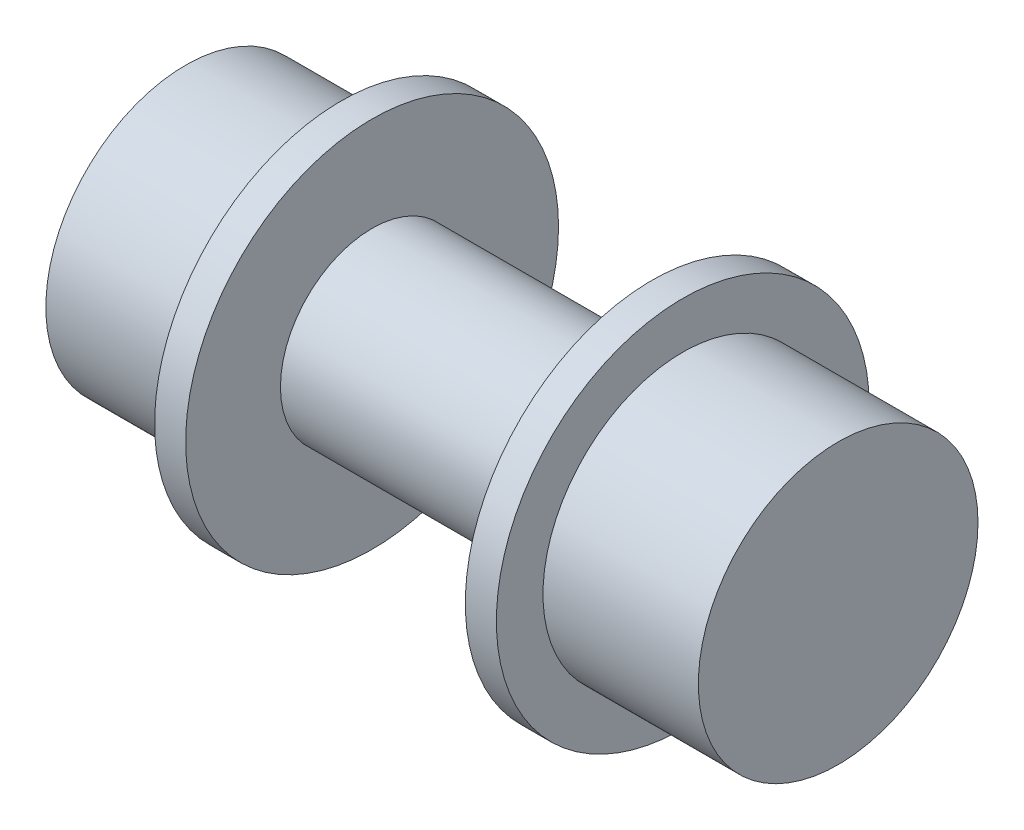
ISO-10303-21;
HEADER;
FILE_DESCRIPTION(('STEP AP214'),'2;1');
FILE_NAME('part.step','',(''),(''),'','','');
FILE_SCHEMA(('AUTOMOTIVE_DESIGN { 1 0 10303 214 1 1 1 1 }'));
ENDSEC;
DATA;
#1=APPLICATION_CONTEXT('core data for automotive mechanical design processes');
#2=APPLICATION_PROTOCOL_DEFINITION('international standard','automotive_design',2000,#1);
#3=PRODUCT_CONTEXT('',#1,'mechanical');
#4=PRODUCT('Part','Part','',(#3));
#5=PRODUCT_RELATED_PRODUCT_CATEGORY('part','',(#4));
#6=PRODUCT_DEFINITION_FORMATION('','',#4);
#7=PRODUCT_DEFINITION_CONTEXT('part definition',#1,'design');
#8=PRODUCT_DEFINITION('design','',#6,#7);
#9=PRODUCT_DEFINITION_SHAPE('','',#8);
#10=(LENGTH_UNIT() NAMED_UNIT(*) SI_UNIT(.MILLI.,.METRE.));
#11=(NAMED_UNIT(*) PLANE_ANGLE_UNIT() SI_UNIT($,.RADIAN.));
#12=(NAMED_UNIT(*) SI_UNIT($,.STERADIAN.) SOLID_ANGLE_UNIT());
#13=UNCERTAINTY_MEASURE_WITH_UNIT(LENGTH_MEASURE(1.E-05),#10,'distance_accuracy_value','');
#14=(GEOMETRIC_REPRESENTATION_CONTEXT(3) GLOBAL_UNCERTAINTY_ASSIGNED_CONTEXT((#13)) GLOBAL_UNIT_ASSIGNED_CONTEXT((#10,
#11,#12)) REPRESENTATION_CONTEXT('',''));
#15=CARTESIAN_POINT('',(0.,0.,0.));
#16=DIRECTION('',(0.,0.,1.));
#17=DIRECTION('',(1.,0.,0.));
#18=AXIS2_PLACEMENT_3D('',#15,#16,#17);
#19=CARTESIAN_POINT('',(57.15,0.,0.));
#20=DIRECTION('',(-1.,0.,0.));
#21=DIRECTION('',(0.,0.,1.));
#22=AXIS2_PLACEMENT_3D('',#19,#20,#21);
#23=CYLINDRICAL_SURFACE('',#22,37.465);
#24=CARTESIAN_POINT('',(57.15,0.,0.));
#25=DIRECTION('',(1.,0.,0.));
#26=DIRECTION('',(0.,0.,-1.));
#27=AXIS2_PLACEMENT_3D('',#24,#25,#26);
#28=CIRCLE('',#27,37.465);
#29=CARTESIAN_POINT('',(57.15,0.,-37.465));
#30=VERTEX_POINT('',#29);
#31=EDGE_CURVE('E49',#30,#30,#28,.T.);
#32=ORIENTED_EDGE('',*,*,#31,.F.);
#33=EDGE_LOOP('',(#32));
#34=FACE_BOUND('',#33,.T.);
#35=CARTESIAN_POINT('',(-57.15,0.,0.));
#36=DIRECTION('',(1.,0.,0.));
#37=DIRECTION('',(0.,0.,-1.));
#38=AXIS2_PLACEMENT_3D('',#35,#36,#37);
#39=CIRCLE('',#38,37.465);
#40=CARTESIAN_POINT('',(-57.15,0.,-37.465));
#41=VERTEX_POINT('',#40);
#42=EDGE_CURVE('E44',#41,#41,#39,.T.);
#43=ORIENTED_EDGE('',*,*,#42,.T.);
#44=EDGE_LOOP('',(#43));
#45=FACE_BOUND('',#44,.T.);
#46=ADVANCED_FACE('F41',(#34,#45),#23,.T.);
#47=CARTESIAN_POINT('',(69.85,0.,0.));
#48=DIRECTION('',(-1.,0.,0.));
#49=DIRECTION('',(0.,0.,1.));
#50=AXIS2_PLACEMENT_3D('',#47,#48,#49);
#51=CYLINDRICAL_SURFACE('',#50,76.2);
#52=CARTESIAN_POINT('',(69.85,0.,0.));
#53=DIRECTION('',(1.,0.,0.));
#54=DIRECTION('',(0.,0.,-1.));
#55=AXIS2_PLACEMENT_3D('',#52,#53,#54);
#56=CIRCLE('',#55,76.2);
#57=CARTESIAN_POINT('',(69.85,0.,-76.2));
#58=VERTEX_POINT('',#57);
#59=EDGE_CURVE('E55',#58,#58,#56,.T.);
#60=ORIENTED_EDGE('',*,*,#59,.F.);
#61=EDGE_LOOP('',(#60));
#62=FACE_BOUND('',#61,.T.);
#63=CARTESIAN_POINT('',(57.15,0.,0.));
#64=DIRECTION('',(1.,0.,0.));
#65=DIRECTION('',(0.,0.,-1.));
#66=AXIS2_PLACEMENT_3D('',#63,#64,#65);
#67=CIRCLE('',#66,76.2);
#68=CARTESIAN_POINT('',(57.15,0.,-76.2));
#69=VERTEX_POINT('',#68);
#70=EDGE_CURVE('E63',#69,#69,#67,.T.);
#71=ORIENTED_EDGE('',*,*,#70,.T.);
#72=EDGE_LOOP('',(#71));
#73=FACE_BOUND('',#72,.T.);
#74=ADVANCED_FACE('F107',(#62,#73),#51,.T.);
#75=CARTESIAN_POINT('',(69.85,0.,0.));
#76=DIRECTION('',(1.,0.,0.));
#77=DIRECTION('',(0.,0.,-1.));
#78=AXIS2_PLACEMENT_3D('',#75,#76,#77);
#79=PLANE('',#78);
#80=CARTESIAN_POINT('',(69.85,0.,0.));
#81=DIRECTION('',(1.,0.,0.));
#82=DIRECTION('',(0.,0.,-1.));
#83=AXIS2_PLACEMENT_3D('',#80,#81,#82);
#84=CIRCLE('',#83,57.15);
#85=CARTESIAN_POINT('',(69.85,0.,-57.15));
#86=VERTEX_POINT('',#85);
#87=EDGE_CURVE('E10',#86,#86,#84,.T.);
#88=ORIENTED_EDGE('',*,*,#87,.F.);
#89=EDGE_LOOP('',(#88));
#90=FACE_BOUND('',#89,.T.);
#91=ORIENTED_EDGE('',*,*,#59,.T.);
#92=EDGE_LOOP('',(#91));
#93=FACE_BOUND('',#92,.T.);
#94=ADVANCED_FACE('F112',(#90,#93),#79,.T.);
#95=CARTESIAN_POINT('',(57.15,0.,0.));
#96=DIRECTION('',(1.,0.,0.));
#97=DIRECTION('',(0.,0.,-1.));
#98=AXIS2_PLACEMENT_3D('',#95,#96,#97);
#99=PLANE('',#98);
#100=ORIENTED_EDGE('',*,*,#31,.T.);
#101=EDGE_LOOP('',(#100));
#102=FACE_BOUND('',#101,.T.);
#103=ORIENTED_EDGE('',*,*,#70,.F.);
#104=EDGE_LOOP('',(#103));
#105=FACE_BOUND('',#104,.T.);
#106=ADVANCED_FACE('F116',(#102,#105),#99,.F.);
#107=CARTESIAN_POINT('',(133.35,0.,0.));
#108=DIRECTION('',(-1.,0.,0.));
#109=DIRECTION('',(0.,0.,1.));
#110=AXIS2_PLACEMENT_3D('',#107,#108,#109);
#111=CYLINDRICAL_SURFACE('',#110,57.15);
#112=CARTESIAN_POINT('',(133.35,0.,0.));
#113=DIRECTION('',(1.,0.,0.));
#114=DIRECTION('',(0.,0.,-1.));
#115=AXIS2_PLACEMENT_3D('',#112,#113,#114);
#116=CIRCLE('',#115,57.15);
#117=CARTESIAN_POINT('',(133.35,0.,-57.15));
#118=VERTEX_POINT('',#117);
#119=EDGE_CURVE('E58',#118,#118,#116,.T.);
#120=ORIENTED_EDGE('',*,*,#119,.F.);
#121=EDGE_LOOP('',(#120));
#122=FACE_BOUND('',#121,.T.);
#123=ORIENTED_EDGE('',*,*,#87,.T.);
#124=EDGE_LOOP('',(#123));
#125=FACE_BOUND('',#124,.T.);
#126=ADVANCED_FACE('F119',(#122,#125),#111,.T.);
#127=CARTESIAN_POINT('',(133.35,0.,0.));
#128=DIRECTION('',(1.,0.,0.));
#129=DIRECTION('',(0.,0.,-1.));
#130=AXIS2_PLACEMENT_3D('',#127,#128,#129);
#131=PLANE('',#130);
#132=ORIENTED_EDGE('',*,*,#119,.T.);
#133=EDGE_LOOP('',(#132));
#134=FACE_BOUND('',#133,.T.);
#135=ADVANCED_FACE('F125',(#134),#131,.T.);
#136=CARTESIAN_POINT('',(-69.85,0.,0.));
#137=DIRECTION('',(1.,0.,0.));
#138=DIRECTION('',(0.,0.,-1.));
#139=AXIS2_PLACEMENT_3D('',#136,#137,#138);
#140=CYLINDRICAL_SURFACE('',#139,76.2);
#141=CARTESIAN_POINT('',(-69.85,0.,0.));
#142=DIRECTION('',(1.,0.,0.));
#143=DIRECTION('',(0.,0.,-1.));
#144=AXIS2_PLACEMENT_3D('',#141,#142,#143);
#145=CIRCLE('',#144,76.2);
#146=CARTESIAN_POINT('',(-69.85,0.,-76.2));
#147=VERTEX_POINT('',#146);
#148=EDGE_CURVE('E74',#147,#147,#145,.T.);
#149=ORIENTED_EDGE('',*,*,#148,.T.);
#150=EDGE_LOOP('',(#149));
#151=FACE_BOUND('',#150,.T.);
#152=CARTESIAN_POINT('',(-57.15,0.,0.));
#153=DIRECTION('',(1.,0.,0.));
#154=DIRECTION('',(0.,0.,-1.));
#155=AXIS2_PLACEMENT_3D('',#152,#153,#154);
#156=CIRCLE('',#155,76.2);
#157=CARTESIAN_POINT('',(-57.15,0.,-76.2));
#158=VERTEX_POINT('',#157);
#159=EDGE_CURVE('E79',#158,#158,#156,.T.);
#160=ORIENTED_EDGE('',*,*,#159,.F.);
#161=EDGE_LOOP('',(#160));
#162=FACE_BOUND('',#161,.T.);
#163=ADVANCED_FACE('F133',(#151,#162),#140,.T.);
#164=CARTESIAN_POINT('',(-69.85,0.,0.));
#165=DIRECTION('',(1.,0.,0.));
#166=DIRECTION('',(0.,0.,-1.));
#167=AXIS2_PLACEMENT_3D('',#164,#165,#166);
#168=PLANE('',#167);
#169=CARTESIAN_POINT('',(-69.85,0.,0.));
#170=DIRECTION('',(1.,0.,0.));
#171=DIRECTION('',(0.,0.,-1.));
#172=AXIS2_PLACEMENT_3D('',#169,#170,#171);
#173=CIRCLE('',#172,57.15);
#174=CARTESIAN_POINT('',(-69.85,0.,-57.15));
#175=VERTEX_POINT('',#174);
#176=EDGE_CURVE('E87',#175,#175,#173,.T.);
#177=ORIENTED_EDGE('',*,*,#176,.T.);
#178=EDGE_LOOP('',(#177));
#179=FACE_BOUND('',#178,.T.);
#180=ORIENTED_EDGE('',*,*,#148,.F.);
#181=EDGE_LOOP('',(#180));
#182=FACE_BOUND('',#181,.T.);
#183=ADVANCED_FACE('F136',(#179,#182),#168,.F.);
#184=CARTESIAN_POINT('',(-57.15,0.,0.));
#185=DIRECTION('',(1.,0.,0.));
#186=DIRECTION('',(0.,0.,-1.));
#187=AXIS2_PLACEMENT_3D('',#184,#185,#186);
#188=PLANE('',#187);
#189=ORIENTED_EDGE('',*,*,#42,.F.);
#190=EDGE_LOOP('',(#189));
#191=FACE_BOUND('',#190,.T.);
#192=ORIENTED_EDGE('',*,*,#159,.T.);
#193=EDGE_LOOP('',(#192));
#194=FACE_BOUND('',#193,.T.);
#195=ADVANCED_FACE('F104',(#191,#194),#188,.T.);
#196=CARTESIAN_POINT('',(-133.35,0.,0.));
#197=DIRECTION('',(1.,0.,0.));
#198=DIRECTION('',(0.,0.,-1.));
#199=AXIS2_PLACEMENT_3D('',#196,#197,#198);
#200=CYLINDRICAL_SURFACE('',#199,57.15);
#201=CARTESIAN_POINT('',(-133.35,0.,0.));
#202=DIRECTION('',(1.,0.,0.));
#203=DIRECTION('',(0.,0.,-1.));
#204=AXIS2_PLACEMENT_3D('',#201,#202,#203);
#205=CIRCLE('',#204,57.15);
#206=CARTESIAN_POINT('',(-133.35,0.,-57.15));
#207=VERTEX_POINT('',#206);
#208=EDGE_CURVE('E85',#207,#207,#205,.T.);
#209=ORIENTED_EDGE('',*,*,#208,.T.);
#210=EDGE_LOOP('',(#209));
#211=FACE_BOUND('',#210,.T.);
#212=ORIENTED_EDGE('',*,*,#176,.F.);
#213=EDGE_LOOP('',(#212));
#214=FACE_BOUND('',#213,.T.);
#215=ADVANCED_FACE('F95',(#211,#214),#200,.T.);
#216=CARTESIAN_POINT('',(-133.35,0.,0.));
#217=DIRECTION('',(1.,0.,0.));
#218=DIRECTION('',(0.,0.,-1.));
#219=AXIS2_PLACEMENT_3D('',#216,#217,#218);
#220=PLANE('',#219);
#221=ORIENTED_EDGE('',*,*,#208,.F.);
#222=EDGE_LOOP('',(#221));
#223=FACE_BOUND('',#222,.T.);
#224=ADVANCED_FACE('F98',(#223),#220,.F.);
#225=CLOSED_SHELL('',(#46,#74,#94,#106,#126,#135,#163,#183,#195,#215,#224));
#226=MANIFOLD_SOLID_BREP('B2',#225);
#227=ADVANCED_BREP_SHAPE_REPRESENTATION('',(#18,#226),#14);
#228=SHAPE_DEFINITION_REPRESENTATION(#9,#227);
ENDSEC;
END-ISO-10303-21;
